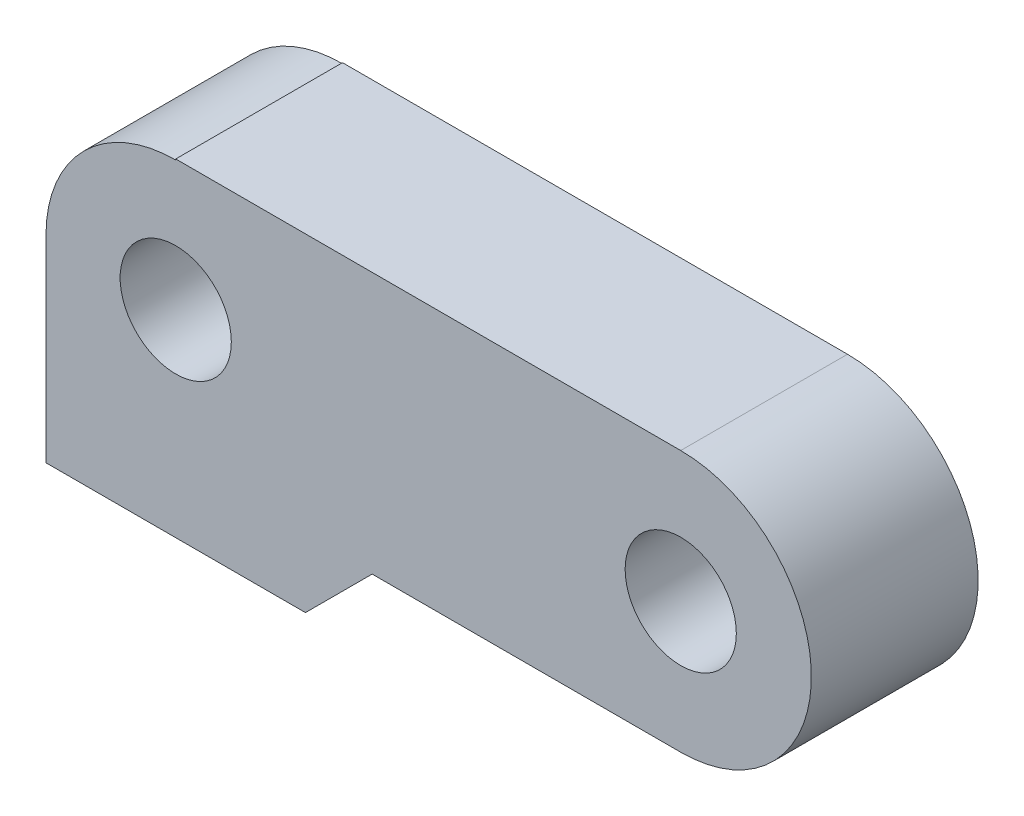
ISO-10303-21;
HEADER;
FILE_DESCRIPTION(('STEP AP214'),'2;1');
FILE_NAME('part.step','',(''),(''),'','','');
FILE_SCHEMA(('AUTOMOTIVE_DESIGN { 1 0 10303 214 1 1 1 1 }'));
ENDSEC;
DATA;
#1=APPLICATION_CONTEXT('core data for automotive mechanical design processes');
#2=APPLICATION_PROTOCOL_DEFINITION('international standard','automotive_design',2000,#1);
#3=PRODUCT_CONTEXT('',#1,'mechanical');
#4=PRODUCT('Part','Part','',(#3));
#5=PRODUCT_RELATED_PRODUCT_CATEGORY('part','',(#4));
#6=PRODUCT_DEFINITION_FORMATION('','',#4);
#7=PRODUCT_DEFINITION_CONTEXT('part definition',#1,'design');
#8=PRODUCT_DEFINITION('design','',#6,#7);
#9=PRODUCT_DEFINITION_SHAPE('','',#8);
#10=(LENGTH_UNIT() NAMED_UNIT(*) SI_UNIT(.MILLI.,.METRE.));
#11=(NAMED_UNIT(*) PLANE_ANGLE_UNIT() SI_UNIT($,.RADIAN.));
#12=(NAMED_UNIT(*) SI_UNIT($,.STERADIAN.) SOLID_ANGLE_UNIT());
#13=UNCERTAINTY_MEASURE_WITH_UNIT(LENGTH_MEASURE(1.E-05),#10,'distance_accuracy_value','');
#14=(GEOMETRIC_REPRESENTATION_CONTEXT(3) GLOBAL_UNCERTAINTY_ASSIGNED_CONTEXT((#13)) GLOBAL_UNIT_ASSIGNED_CONTEXT((#10,
#11,#12)) REPRESENTATION_CONTEXT('',''));
#15=CARTESIAN_POINT('',(0.,0.,0.));
#16=DIRECTION('',(0.,0.,1.));
#17=DIRECTION('',(1.,0.,0.));
#18=AXIS2_PLACEMENT_3D('',#15,#16,#17);
#19=CARTESIAN_POINT('',(27.,3.59999999999999,18.));
#20=DIRECTION('',(0.,0.,-1.));
#21=DIRECTION('',(-1.,0.,0.));
#22=AXIS2_PLACEMENT_3D('',#19,#20,#21);
#23=CYLINDRICAL_SURFACE('',#22,5.99999999999999);
#24=CARTESIAN_POINT('',(27.,3.59999999999999,18.));
#25=DIRECTION('',(0.,0.,1.));
#26=DIRECTION('',(1.,0.,0.));
#27=AXIS2_PLACEMENT_3D('',#24,#25,#26);
#28=CIRCLE('',#27,5.99999999999999);
#29=CARTESIAN_POINT('',(33.,3.59999999999999,18.));
#30=VERTEX_POINT('',#29);
#31=EDGE_CURVE('E148',#30,#30,#28,.T.);
#32=ORIENTED_EDGE('',*,*,#31,.T.);
#33=EDGE_LOOP('',(#32));
#34=FACE_BOUND('',#33,.T.);
#35=CARTESIAN_POINT('',(27.,3.59999999999999,5.));
#36=DIRECTION('',(0.,0.,-1.));
#37=DIRECTION('',(-1.,0.,0.));
#38=AXIS2_PLACEMENT_3D('',#35,#36,#37);
#39=CIRCLE('',#38,5.99999999999999);
#40=CARTESIAN_POINT('',(21.,3.59999999999999,5.));
#41=VERTEX_POINT('',#40);
#42=EDGE_CURVE('E39',#41,#41,#39,.T.);
#43=ORIENTED_EDGE('',*,*,#42,.T.);
#44=EDGE_LOOP('',(#43));
#45=FACE_BOUND('',#44,.T.);
#46=ADVANCED_FACE('F35',(#34,#45),#23,.F.);
#47=CARTESIAN_POINT('',(0.,0.,18.));
#48=DIRECTION('',(0.,0.,-1.));
#49=DIRECTION('',(-1.,0.,0.));
#50=AXIS2_PLACEMENT_3D('',#47,#48,#49);
#51=PLANE('',#50);
#52=DIRECTION('',(0.,1.,0.));
#53=VECTOR('',#52,1.);
#54=CARTESIAN_POINT('',(-27.5,17.6,18.));
#55=LINE('',#54,#53);
#56=CARTESIAN_POINT('',(-27.5,17.6,18.));
#57=VERTEX_POINT('',#56);
#58=CARTESIAN_POINT('',(-27.5,17.7,18.));
#59=VERTEX_POINT('',#58);
#60=EDGE_CURVE('E120',#57,#59,#55,.T.);
#61=ORIENTED_EDGE('',*,*,#60,.F.);
#62=CARTESIAN_POINT('',(-27.5,3.59999999999999,18.));
#63=DIRECTION('',(0.,0.,-1.));
#64=DIRECTION('',(1.,0.,0.));
#65=AXIS2_PLACEMENT_3D('',#62,#63,#64);
#66=CIRCLE('',#65,14.);
#67=CARTESIAN_POINT('',(-41.5,3.59999999999999,18.));
#68=VERTEX_POINT('',#67);
#69=EDGE_CURVE('E103',#68,#57,#66,.T.);
#70=ORIENTED_EDGE('',*,*,#69,.F.);
#71=DIRECTION('',(0.,-1.,0.));
#72=VECTOR('',#71,1.);
#73=CARTESIAN_POINT('',(-41.5,-17.7,18.));
#74=LINE('',#73,#72);
#75=CARTESIAN_POINT('',(-41.5,-17.7,18.));
#76=VERTEX_POINT('',#75);
#77=EDGE_CURVE('E166',#68,#76,#74,.T.);
#78=ORIENTED_EDGE('',*,*,#77,.T.);
#79=DIRECTION('',(1.,0.,0.));
#80=VECTOR('',#79,1.);
#81=CARTESIAN_POINT('',(-41.5,-17.7,18.));
#82=LINE('',#81,#80);
#83=CARTESIAN_POINT('',(-13.5,-17.7,18.));
#84=VERTEX_POINT('',#83);
#85=EDGE_CURVE('E169',#76,#84,#82,.T.);
#86=ORIENTED_EDGE('',*,*,#85,.T.);
#87=DIRECTION('',(-0.707106781186551,-0.707106781186544,0.));
#88=VECTOR('',#87,1.);
#89=CARTESIAN_POINT('',(-6.29999999999995,-10.5,18.));
#90=LINE('',#89,#88);
#91=CARTESIAN_POINT('',(-6.29999999999995,-10.5,18.));
#92=VERTEX_POINT('',#91);
#93=EDGE_CURVE('E59',#92,#84,#90,.T.);
#94=ORIENTED_EDGE('',*,*,#93,.F.);
#95=DIRECTION('',(-1.,0.,0.));
#96=VECTOR('',#95,1.);
#97=CARTESIAN_POINT('',(27.,-10.5,18.));
#98=LINE('',#97,#96);
#99=CARTESIAN_POINT('',(27.,-10.5,18.));
#100=VERTEX_POINT('',#99);
#101=EDGE_CURVE('E142',#100,#92,#98,.T.);
#102=ORIENTED_EDGE('',*,*,#101,.F.);
#103=CARTESIAN_POINT('',(27.,3.59999999999999,18.));
#104=DIRECTION('',(0.,0.,-1.));
#105=DIRECTION('',(1.,0.,0.));
#106=AXIS2_PLACEMENT_3D('',#103,#104,#105);
#107=CIRCLE('',#106,14.1);
#108=CARTESIAN_POINT('',(27.,17.7,18.));
#109=VERTEX_POINT('',#108);
#110=EDGE_CURVE('E128',#109,#100,#107,.T.);
#111=ORIENTED_EDGE('',*,*,#110,.F.);
#112=DIRECTION('',(-1.,0.,0.));
#113=VECTOR('',#112,1.);
#114=CARTESIAN_POINT('',(-41.5,17.7,18.));
#115=LINE('',#114,#113);
#116=EDGE_CURVE('E163',#109,#59,#115,.T.);
#117=ORIENTED_EDGE('',*,*,#116,.T.);
#118=EDGE_LOOP('',(#61,#70,#78,#86,#94,#102,#111,#117));
#119=FACE_BOUND('',#118,.T.);
#120=CARTESIAN_POINT('',(-27.5,3.59999999999999,18.));
#121=DIRECTION('',(0.,0.,1.));
#122=DIRECTION('',(1.,0.,0.));
#123=AXIS2_PLACEMENT_3D('',#120,#121,#122);
#124=CIRCLE('',#123,6.);
#125=CARTESIAN_POINT('',(-21.5,3.59999999999999,18.));
#126=VERTEX_POINT('',#125);
#127=EDGE_CURVE('E157',#126,#126,#124,.T.);
#128=ORIENTED_EDGE('',*,*,#127,.F.);
#129=EDGE_LOOP('',(#128));
#130=FACE_BOUND('',#129,.T.);
#131=ORIENTED_EDGE('',*,*,#31,.F.);
#132=EDGE_LOOP('',(#131));
#133=FACE_BOUND('',#132,.T.);
#134=ADVANCED_FACE('F187',(#119,#130,#133),#51,.F.);
#135=CARTESIAN_POINT('',(0.,0.,0.));
#136=DIRECTION('',(0.,0.,-1.));
#137=DIRECTION('',(-1.,0.,0.));
#138=AXIS2_PLACEMENT_3D('',#135,#136,#137);
#139=PLANE('',#138);
#140=CARTESIAN_POINT('',(27.,3.59999999999999,0.));
#141=DIRECTION('',(0.,0.,-1.));
#142=DIRECTION('',(-1.,0.,0.));
#143=AXIS2_PLACEMENT_3D('',#140,#141,#142);
#144=CIRCLE('',#143,10.);
#145=CARTESIAN_POINT('',(17.,3.59999999999999,0.));
#146=VERTEX_POINT('',#145);
#147=EDGE_CURVE('E124',#146,#146,#144,.T.);
#148=ORIENTED_EDGE('',*,*,#147,.F.);
#149=EDGE_LOOP('',(#148));
#150=FACE_BOUND('',#149,.T.);
#151=CARTESIAN_POINT('',(-27.5,3.59999999999999,0.));
#152=DIRECTION('',(0.,0.,-1.));
#153=DIRECTION('',(1.,0.,0.));
#154=AXIS2_PLACEMENT_3D('',#151,#152,#153);
#155=CIRCLE('',#154,14.);
#156=CARTESIAN_POINT('',(-41.5,3.59999999999999,0.));
#157=VERTEX_POINT('',#156);
#158=CARTESIAN_POINT('',(-27.5,17.6,0.));
#159=VERTEX_POINT('',#158);
#160=EDGE_CURVE('E51',#157,#159,#155,.T.);
#161=ORIENTED_EDGE('',*,*,#160,.T.);
#162=DIRECTION('',(0.,1.,0.));
#163=VECTOR('',#162,1.);
#164=CARTESIAN_POINT('',(-27.5,17.6,0.));
#165=LINE('',#164,#163);
#166=CARTESIAN_POINT('',(-27.5,17.7,0.));
#167=VERTEX_POINT('',#166);
#168=EDGE_CURVE('E107',#159,#167,#165,.T.);
#169=ORIENTED_EDGE('',*,*,#168,.T.);
#170=DIRECTION('',(-1.,0.,0.));
#171=VECTOR('',#170,1.);
#172=CARTESIAN_POINT('',(-41.5,17.7,0.));
#173=LINE('',#172,#171);
#174=CARTESIAN_POINT('',(27.,17.7,0.));
#175=VERTEX_POINT('',#174);
#176=EDGE_CURVE('E160',#175,#167,#173,.T.);
#177=ORIENTED_EDGE('',*,*,#176,.F.);
#178=CARTESIAN_POINT('',(27.,3.59999999999999,0.));
#179=DIRECTION('',(0.,0.,-1.));
#180=DIRECTION('',(1.,0.,0.));
#181=AXIS2_PLACEMENT_3D('',#178,#179,#180);
#182=CIRCLE('',#181,14.1);
#183=CARTESIAN_POINT('',(27.,-10.5,0.));
#184=VERTEX_POINT('',#183);
#185=EDGE_CURVE('E130',#175,#184,#182,.T.);
#186=ORIENTED_EDGE('',*,*,#185,.T.);
#187=DIRECTION('',(-1.,0.,0.));
#188=VECTOR('',#187,1.);
#189=CARTESIAN_POINT('',(27.,-10.5,0.));
#190=LINE('',#189,#188);
#191=CARTESIAN_POINT('',(-6.29999999999995,-10.5,0.));
#192=VERTEX_POINT('',#191);
#193=EDGE_CURVE('E133',#184,#192,#190,.T.);
#194=ORIENTED_EDGE('',*,*,#193,.T.);
#195=DIRECTION('',(-0.707106781186551,-0.707106781186544,0.));
#196=VECTOR('',#195,1.);
#197=CARTESIAN_POINT('',(-6.29999999999995,-10.5,0.));
#198=LINE('',#197,#196);
#199=CARTESIAN_POINT('',(-13.5,-17.7,0.));
#200=VERTEX_POINT('',#199);
#201=EDGE_CURVE('E136',#192,#200,#198,.T.);
#202=ORIENTED_EDGE('',*,*,#201,.T.);
#203=DIRECTION('',(1.,0.,0.));
#204=VECTOR('',#203,1.);
#205=CARTESIAN_POINT('',(-41.5,-17.7,0.));
#206=LINE('',#205,#204);
#207=CARTESIAN_POINT('',(-41.5,-17.7,0.));
#208=VERTEX_POINT('',#207);
#209=EDGE_CURVE('E167',#208,#200,#206,.T.);
#210=ORIENTED_EDGE('',*,*,#209,.F.);
#211=DIRECTION('',(0.,-1.,0.));
#212=VECTOR('',#211,1.);
#213=CARTESIAN_POINT('',(-41.5,-17.7,0.));
#214=LINE('',#213,#212);
#215=EDGE_CURVE('E119',#157,#208,#214,.T.);
#216=ORIENTED_EDGE('',*,*,#215,.F.);
#217=EDGE_LOOP('',(#161,#169,#177,#186,#194,#202,#210,#216));
#218=FACE_BOUND('',#217,.T.);
#219=CARTESIAN_POINT('',(-27.5,3.59999999999999,0.));
#220=DIRECTION('',(0.,0.,1.));
#221=DIRECTION('',(1.,0.,0.));
#222=AXIS2_PLACEMENT_3D('',#219,#220,#221);
#223=CIRCLE('',#222,6.);
#224=CARTESIAN_POINT('',(-21.5,3.59999999999999,0.));
#225=VERTEX_POINT('',#224);
#226=EDGE_CURVE('E156',#225,#225,#223,.T.);
#227=ORIENTED_EDGE('',*,*,#226,.T.);
#228=EDGE_LOOP('',(#227));
#229=FACE_BOUND('',#228,.T.);
#230=ADVANCED_FACE('F116',(#150,#218,#229),#139,.T.);
#231=CARTESIAN_POINT('',(-41.5,17.7,18.));
#232=DIRECTION('',(0.,-1.,0.));
#233=DIRECTION('',(0.,0.,-1.));
#234=AXIS2_PLACEMENT_3D('',#231,#232,#233);
#235=PLANE('',#234);
#236=ORIENTED_EDGE('',*,*,#176,.T.);
#237=DIRECTION('',(0.,0.,1.));
#238=VECTOR('',#237,1.);
#239=CARTESIAN_POINT('',(-27.5,17.7,18.));
#240=LINE('',#239,#238);
#241=EDGE_CURVE('E11',#167,#59,#240,.T.);
#242=ORIENTED_EDGE('',*,*,#241,.T.);
#243=ORIENTED_EDGE('',*,*,#116,.F.);
#244=DIRECTION('',(0.,0.,1.));
#245=VECTOR('',#244,1.);
#246=CARTESIAN_POINT('',(27.,17.7,0.));
#247=LINE('',#246,#245);
#248=EDGE_CURVE('E146',#175,#109,#247,.T.);
#249=ORIENTED_EDGE('',*,*,#248,.F.);
#250=EDGE_LOOP('',(#236,#242,#243,#249));
#251=FACE_BOUND('',#250,.T.);
#252=ADVANCED_FACE('F37',(#251),#235,.F.);
#253=CARTESIAN_POINT('',(-41.5,-17.7,18.));
#254=DIRECTION('',(1.,0.,0.));
#255=DIRECTION('',(0.,0.,-1.));
#256=AXIS2_PLACEMENT_3D('',#253,#254,#255);
#257=PLANE('',#256);
#258=ORIENTED_EDGE('',*,*,#77,.F.);
#259=DIRECTION('',(0.,0.,1.));
#260=VECTOR('',#259,1.);
#261=CARTESIAN_POINT('',(-41.5,3.59999999999999,0.));
#262=LINE('',#261,#260);
#263=EDGE_CURVE('E106',#157,#68,#262,.T.);
#264=ORIENTED_EDGE('',*,*,#263,.F.);
#265=ORIENTED_EDGE('',*,*,#215,.T.);
#266=DIRECTION('',(0.,0.,-1.));
#267=VECTOR('',#266,1.);
#268=CARTESIAN_POINT('',(-41.5,-17.7,18.));
#269=LINE('',#268,#267);
#270=EDGE_CURVE('E44',#76,#208,#269,.T.);
#271=ORIENTED_EDGE('',*,*,#270,.F.);
#272=EDGE_LOOP('',(#258,#264,#265,#271));
#273=FACE_BOUND('',#272,.T.);
#274=ADVANCED_FACE('F190',(#273),#257,.F.);
#275=CARTESIAN_POINT('',(-41.5,-17.7,18.));
#276=DIRECTION('',(0.,1.,0.));
#277=DIRECTION('',(0.,0.,1.));
#278=AXIS2_PLACEMENT_3D('',#275,#276,#277);
#279=PLANE('',#278);
#280=ORIENTED_EDGE('',*,*,#209,.T.);
#281=DIRECTION('',(0.,0.,1.));
#282=VECTOR('',#281,1.);
#283=CARTESIAN_POINT('',(-13.5,-17.7,0.));
#284=LINE('',#283,#282);
#285=EDGE_CURVE('E149',#200,#84,#284,.T.);
#286=ORIENTED_EDGE('',*,*,#285,.T.);
#287=ORIENTED_EDGE('',*,*,#85,.F.);
#288=ORIENTED_EDGE('',*,*,#270,.T.);
#289=EDGE_LOOP('',(#280,#286,#287,#288));
#290=FACE_BOUND('',#289,.T.);
#291=ADVANCED_FACE('F180',(#290),#279,.F.);
#292=CARTESIAN_POINT('',(-27.5,3.59999999999999,18.));
#293=DIRECTION('',(0.,0.,-1.));
#294=DIRECTION('',(-1.,0.,0.));
#295=AXIS2_PLACEMENT_3D('',#292,#293,#294);
#296=CYLINDRICAL_SURFACE('',#295,6.);
#297=ORIENTED_EDGE('',*,*,#127,.T.);
#298=EDGE_LOOP('',(#297));
#299=FACE_BOUND('',#298,.T.);
#300=ORIENTED_EDGE('',*,*,#226,.F.);
#301=EDGE_LOOP('',(#300));
#302=FACE_BOUND('',#301,.T.);
#303=ADVANCED_FACE('F196',(#299,#302),#296,.F.);
#304=CARTESIAN_POINT('',(27.,3.59999999999999,0.));
#305=DIRECTION('',(0.,0.,1.));
#306=DIRECTION('',(1.,0.,0.));
#307=AXIS2_PLACEMENT_3D('',#304,#305,#306);
#308=CYLINDRICAL_SURFACE('',#307,14.1);
#309=ORIENTED_EDGE('',*,*,#110,.T.);
#310=DIRECTION('',(0.,0.,1.));
#311=VECTOR('',#310,1.);
#312=CARTESIAN_POINT('',(27.,-10.5,0.));
#313=LINE('',#312,#311);
#314=EDGE_CURVE('E139',#184,#100,#313,.T.);
#315=ORIENTED_EDGE('',*,*,#314,.F.);
#316=ORIENTED_EDGE('',*,*,#185,.F.);
#317=ORIENTED_EDGE('',*,*,#248,.T.);
#318=EDGE_LOOP('',(#309,#315,#316,#317));
#319=FACE_BOUND('',#318,.T.);
#320=ADVANCED_FACE('F211',(#319),#308,.T.);
#321=CARTESIAN_POINT('',(-6.29999999999995,-10.5,0.));
#322=DIRECTION('',(-0.707106781186544,0.707106781186551,0.));
#323=DIRECTION('',(-0.707106781186551,-0.707106781186544,0.));
#324=AXIS2_PLACEMENT_3D('',#321,#322,#323);
#325=PLANE('',#324);
#326=ORIENTED_EDGE('',*,*,#93,.T.);
#327=ORIENTED_EDGE('',*,*,#285,.F.);
#328=ORIENTED_EDGE('',*,*,#201,.F.);
#329=DIRECTION('',(0.,0.,1.));
#330=VECTOR('',#329,1.);
#331=CARTESIAN_POINT('',(-6.29999999999995,-10.5,0.));
#332=LINE('',#331,#330);
#333=EDGE_CURVE('E151',#192,#92,#332,.T.);
#334=ORIENTED_EDGE('',*,*,#333,.T.);
#335=EDGE_LOOP('',(#326,#327,#328,#334));
#336=FACE_BOUND('',#335,.T.);
#337=ADVANCED_FACE('F185',(#336),#325,.F.);
#338=CARTESIAN_POINT('',(27.,-10.5,0.));
#339=DIRECTION('',(0.,1.,0.));
#340=DIRECTION('',(-1.,0.,0.));
#341=AXIS2_PLACEMENT_3D('',#338,#339,#340);
#342=PLANE('',#341);
#343=ORIENTED_EDGE('',*,*,#101,.T.);
#344=ORIENTED_EDGE('',*,*,#333,.F.);
#345=ORIENTED_EDGE('',*,*,#193,.F.);
#346=ORIENTED_EDGE('',*,*,#314,.T.);
#347=EDGE_LOOP('',(#343,#344,#345,#346));
#348=FACE_BOUND('',#347,.T.);
#349=ADVANCED_FACE('F242',(#348),#342,.F.);
#350=CARTESIAN_POINT('',(-27.5,17.6,0.));
#351=DIRECTION('',(1.,0.,0.));
#352=DIRECTION('',(0.,0.,-1.));
#353=AXIS2_PLACEMENT_3D('',#350,#351,#352);
#354=PLANE('',#353);
#355=ORIENTED_EDGE('',*,*,#168,.F.);
#356=DIRECTION('',(0.,0.,1.));
#357=VECTOR('',#356,1.);
#358=CARTESIAN_POINT('',(-27.5,17.6,0.));
#359=LINE('',#358,#357);
#360=EDGE_CURVE('E99',#159,#57,#359,.T.);
#361=ORIENTED_EDGE('',*,*,#360,.T.);
#362=ORIENTED_EDGE('',*,*,#60,.T.);
#363=ORIENTED_EDGE('',*,*,#241,.F.);
#364=EDGE_LOOP('',(#355,#361,#362,#363));
#365=FACE_BOUND('',#364,.T.);
#366=ADVANCED_FACE('F110',(#365),#354,.F.);
#367=CARTESIAN_POINT('',(-27.5,3.59999999999999,0.));
#368=DIRECTION('',(0.,0.,1.));
#369=DIRECTION('',(1.,0.,0.));
#370=AXIS2_PLACEMENT_3D('',#367,#368,#369);
#371=CYLINDRICAL_SURFACE('',#370,14.);
#372=ORIENTED_EDGE('',*,*,#69,.T.);
#373=ORIENTED_EDGE('',*,*,#360,.F.);
#374=ORIENTED_EDGE('',*,*,#160,.F.);
#375=ORIENTED_EDGE('',*,*,#263,.T.);
#376=EDGE_LOOP('',(#372,#373,#374,#375));
#377=FACE_BOUND('',#376,.T.);
#378=ADVANCED_FACE('F101',(#377),#371,.T.);
#379=CARTESIAN_POINT('',(27.,3.59999999999999,5.));
#380=DIRECTION('',(0.,0.,-1.));
#381=DIRECTION('',(-1.,0.,0.));
#382=AXIS2_PLACEMENT_3D('',#379,#380,#381);
#383=CYLINDRICAL_SURFACE('',#382,10.);
#384=CARTESIAN_POINT('',(27.,3.59999999999999,5.));
#385=DIRECTION('',(0.,0.,-1.));
#386=DIRECTION('',(-1.,0.,0.));
#387=AXIS2_PLACEMENT_3D('',#384,#385,#386);
#388=CIRCLE('',#387,10.);
#389=CARTESIAN_POINT('',(17.,3.59999999999999,5.));
#390=VERTEX_POINT('',#389);
#391=EDGE_CURVE('E223',#390,#390,#388,.T.);
#392=ORIENTED_EDGE('',*,*,#391,.F.);
#393=EDGE_LOOP('',(#392));
#394=FACE_BOUND('',#393,.T.);
#395=ORIENTED_EDGE('',*,*,#147,.T.);
#396=EDGE_LOOP('',(#395));
#397=FACE_BOUND('',#396,.T.);
#398=ADVANCED_FACE('F232',(#394,#397),#383,.F.);
#399=CARTESIAN_POINT('',(27.,3.59999999999999,5.));
#400=DIRECTION('',(0.,0.,-1.));
#401=DIRECTION('',(-1.,0.,0.));
#402=AXIS2_PLACEMENT_3D('',#399,#400,#401);
#403=PLANE('',#402);
#404=ORIENTED_EDGE('',*,*,#42,.F.);
#405=EDGE_LOOP('',(#404));
#406=FACE_BOUND('',#405,.T.);
#407=ORIENTED_EDGE('',*,*,#391,.T.);
#408=EDGE_LOOP('',(#407));
#409=FACE_BOUND('',#408,.T.);
#410=ADVANCED_FACE('F230',(#406,#409),#403,.T.);
#411=CLOSED_SHELL('',(#46,#134,#230,#252,#274,#291,#303,#320,#337,#349,#366,#378,#398,#410));
#412=MANIFOLD_SOLID_BREP('B2',#411);
#413=ADVANCED_BREP_SHAPE_REPRESENTATION('',(#18,#412),#14);
#414=SHAPE_DEFINITION_REPRESENTATION(#9,#413);
ENDSEC;
END-ISO-10303-21;
